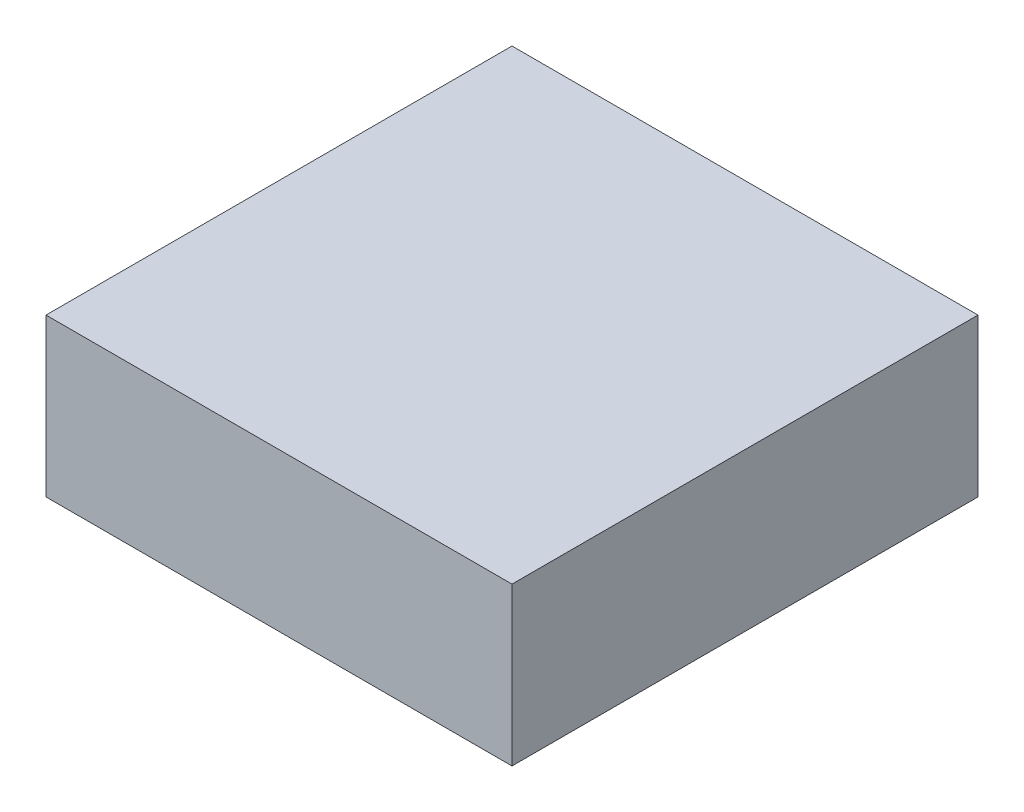
ISO-10303-21;
HEADER;
FILE_DESCRIPTION(('STEP AP214'),'2;1');
FILE_NAME('part.step','',(''),(''),'','','');
FILE_SCHEMA(('AUTOMOTIVE_DESIGN { 1 0 10303 214 1 1 1 1 }'));
ENDSEC;
DATA;
#1=APPLICATION_CONTEXT('core data for automotive mechanical design processes');
#2=APPLICATION_PROTOCOL_DEFINITION('international standard','automotive_design',2000,#1);
#3=PRODUCT_CONTEXT('',#1,'mechanical');
#4=PRODUCT('Part','Part','',(#3));
#5=PRODUCT_RELATED_PRODUCT_CATEGORY('part','',(#4));
#6=PRODUCT_DEFINITION_FORMATION('','',#4);
#7=PRODUCT_DEFINITION_CONTEXT('part definition',#1,'design');
#8=PRODUCT_DEFINITION('design','',#6,#7);
#9=PRODUCT_DEFINITION_SHAPE('','',#8);
#10=(LENGTH_UNIT() NAMED_UNIT(*) SI_UNIT(.MILLI.,.METRE.));
#11=(NAMED_UNIT(*) PLANE_ANGLE_UNIT() SI_UNIT($,.RADIAN.));
#12=(NAMED_UNIT(*) SI_UNIT($,.STERADIAN.) SOLID_ANGLE_UNIT());
#13=UNCERTAINTY_MEASURE_WITH_UNIT(LENGTH_MEASURE(1.E-05),#10,'distance_accuracy_value','');
#14=(GEOMETRIC_REPRESENTATION_CONTEXT(3) GLOBAL_UNCERTAINTY_ASSIGNED_CONTEXT((#13)) GLOBAL_UNIT_ASSIGNED_CONTEXT((#10,
#11,#12)) REPRESENTATION_CONTEXT('',''));
#15=CARTESIAN_POINT('',(0.,0.,0.));
#16=DIRECTION('',(0.,0.,1.));
#17=DIRECTION('',(1.,0.,0.));
#18=AXIS2_PLACEMENT_3D('',#15,#16,#17);
#19=CARTESIAN_POINT('',(-9.017,6.096,-9.017));
#20=DIRECTION('',(0.,0.,-1.));
#21=DIRECTION('',(-1.,0.,0.));
#22=AXIS2_PLACEMENT_3D('',#19,#20,#21);
#23=PLANE('',#22);
#24=DIRECTION('',(1.,0.,0.));
#25=VECTOR('',#24,1.);
#26=CARTESIAN_POINT('',(-9.017,0.,-9.017));
#27=LINE('',#26,#25);
#28=CARTESIAN_POINT('',(-9.017,0.,-9.017));
#29=VERTEX_POINT('',#28);
#30=CARTESIAN_POINT('',(9.017,0.,-9.017));
#31=VERTEX_POINT('',#30);
#32=EDGE_CURVE('E109',#29,#31,#27,.T.);
#33=ORIENTED_EDGE('',*,*,#32,.F.);
#34=DIRECTION('',(0.,-1.,0.));
#35=VECTOR('',#34,1.);
#36=CARTESIAN_POINT('',(-9.017,6.096,-9.017));
#37=LINE('',#36,#35);
#38=CARTESIAN_POINT('',(-9.017,6.096,-9.017));
#39=VERTEX_POINT('',#38);
#40=EDGE_CURVE('E11',#39,#29,#37,.T.);
#41=ORIENTED_EDGE('',*,*,#40,.F.);
#42=DIRECTION('',(1.,0.,0.));
#43=VECTOR('',#42,1.);
#44=CARTESIAN_POINT('',(-9.017,6.096,-9.017));
#45=LINE('',#44,#43);
#46=CARTESIAN_POINT('',(9.017,6.096,-9.017));
#47=VERTEX_POINT('',#46);
#48=EDGE_CURVE('E101',#39,#47,#45,.T.);
#49=ORIENTED_EDGE('',*,*,#48,.T.);
#50=DIRECTION('',(0.,-1.,0.));
#51=VECTOR('',#50,1.);
#52=CARTESIAN_POINT('',(9.017,6.096,-9.017));
#53=LINE('',#52,#51);
#54=EDGE_CURVE('E42',#47,#31,#53,.T.);
#55=ORIENTED_EDGE('',*,*,#54,.T.);
#56=EDGE_LOOP('',(#33,#41,#49,#55));
#57=FACE_BOUND('',#56,.T.);
#58=ADVANCED_FACE('F39',(#57),#23,.T.);
#59=CARTESIAN_POINT('',(-9.017,6.096,9.017));
#60=DIRECTION('',(-1.,0.,0.));
#61=DIRECTION('',(0.,0.,1.));
#62=AXIS2_PLACEMENT_3D('',#59,#60,#61);
#63=PLANE('',#62);
#64=DIRECTION('',(0.,0.,-1.));
#65=VECTOR('',#64,1.);
#66=CARTESIAN_POINT('',(-9.017,0.,9.017));
#67=LINE('',#66,#65);
#68=CARTESIAN_POINT('',(-9.017,0.,9.017));
#69=VERTEX_POINT('',#68);
#70=EDGE_CURVE('E104',#69,#29,#67,.T.);
#71=ORIENTED_EDGE('',*,*,#70,.F.);
#72=DIRECTION('',(0.,-1.,0.));
#73=VECTOR('',#72,1.);
#74=CARTESIAN_POINT('',(-9.017,6.096,9.017));
#75=LINE('',#74,#73);
#76=CARTESIAN_POINT('',(-9.017,6.096,9.017));
#77=VERTEX_POINT('',#76);
#78=EDGE_CURVE('E49',#77,#69,#75,.T.);
#79=ORIENTED_EDGE('',*,*,#78,.F.);
#80=DIRECTION('',(0.,0.,-1.));
#81=VECTOR('',#80,1.);
#82=CARTESIAN_POINT('',(-9.017,6.096,9.017));
#83=LINE('',#82,#81);
#84=EDGE_CURVE('E88',#77,#39,#83,.T.);
#85=ORIENTED_EDGE('',*,*,#84,.T.);
#86=ORIENTED_EDGE('',*,*,#40,.T.);
#87=EDGE_LOOP('',(#71,#79,#85,#86));
#88=FACE_BOUND('',#87,.T.);
#89=ADVANCED_FACE('F125',(#88),#63,.T.);
#90=CARTESIAN_POINT('',(-9.017,6.096,9.017));
#91=DIRECTION('',(0.,0.,-1.));
#92=DIRECTION('',(-1.,0.,0.));
#93=AXIS2_PLACEMENT_3D('',#90,#91,#92);
#94=PLANE('',#93);
#95=DIRECTION('',(1.,0.,0.));
#96=VECTOR('',#95,1.);
#97=CARTESIAN_POINT('',(-9.017,0.,9.017));
#98=LINE('',#97,#96);
#99=CARTESIAN_POINT('',(9.017,0.,9.017));
#100=VERTEX_POINT('',#99);
#101=EDGE_CURVE('E94',#69,#100,#98,.T.);
#102=ORIENTED_EDGE('',*,*,#101,.T.);
#103=DIRECTION('',(0.,-1.,0.));
#104=VECTOR('',#103,1.);
#105=CARTESIAN_POINT('',(9.017,6.096,9.017));
#106=LINE('',#105,#104);
#107=CARTESIAN_POINT('',(9.017,6.096,9.017));
#108=VERTEX_POINT('',#107);
#109=EDGE_CURVE('E92',#108,#100,#106,.T.);
#110=ORIENTED_EDGE('',*,*,#109,.F.);
#111=DIRECTION('',(1.,0.,0.));
#112=VECTOR('',#111,1.);
#113=CARTESIAN_POINT('',(-9.017,6.096,9.017));
#114=LINE('',#113,#112);
#115=EDGE_CURVE('E85',#77,#108,#114,.T.);
#116=ORIENTED_EDGE('',*,*,#115,.F.);
#117=ORIENTED_EDGE('',*,*,#78,.T.);
#118=EDGE_LOOP('',(#102,#110,#116,#117));
#119=FACE_BOUND('',#118,.T.);
#120=ADVANCED_FACE('F93',(#119),#94,.F.);
#121=CARTESIAN_POINT('',(9.017,6.096,9.017));
#122=DIRECTION('',(-1.,0.,0.));
#123=DIRECTION('',(0.,0.,1.));
#124=AXIS2_PLACEMENT_3D('',#121,#122,#123);
#125=PLANE('',#124);
#126=DIRECTION('',(0.,0.,-1.));
#127=VECTOR('',#126,1.);
#128=CARTESIAN_POINT('',(9.017,0.,9.017));
#129=LINE('',#128,#127);
#130=EDGE_CURVE('E113',#100,#31,#129,.T.);
#131=ORIENTED_EDGE('',*,*,#130,.T.);
#132=ORIENTED_EDGE('',*,*,#54,.F.);
#133=DIRECTION('',(0.,0.,-1.));
#134=VECTOR('',#133,1.);
#135=CARTESIAN_POINT('',(9.017,6.096,9.017));
#136=LINE('',#135,#134);
#137=EDGE_CURVE('E82',#108,#47,#136,.T.);
#138=ORIENTED_EDGE('',*,*,#137,.F.);
#139=ORIENTED_EDGE('',*,*,#109,.T.);
#140=EDGE_LOOP('',(#131,#132,#138,#139));
#141=FACE_BOUND('',#140,.T.);
#142=ADVANCED_FACE('F99',(#141),#125,.F.);
#143=CARTESIAN_POINT('',(0.,6.096,0.));
#144=DIRECTION('',(0.,1.,0.));
#145=DIRECTION('',(0.,0.,1.));
#146=AXIS2_PLACEMENT_3D('',#143,#144,#145);
#147=PLANE('',#146);
#148=ORIENTED_EDGE('',*,*,#48,.F.);
#149=ORIENTED_EDGE('',*,*,#84,.F.);
#150=ORIENTED_EDGE('',*,*,#115,.T.);
#151=ORIENTED_EDGE('',*,*,#137,.T.);
#152=EDGE_LOOP('',(#148,#149,#150,#151));
#153=FACE_BOUND('',#152,.T.);
#154=ADVANCED_FACE('F87',(#153),#147,.T.);
#155=CARTESIAN_POINT('',(0.,0.,0.));
#156=DIRECTION('',(0.,1.,0.));
#157=DIRECTION('',(0.,0.,1.));
#158=AXIS2_PLACEMENT_3D('',#155,#156,#157);
#159=PLANE('',#158);
#160=ORIENTED_EDGE('',*,*,#32,.T.);
#161=ORIENTED_EDGE('',*,*,#130,.F.);
#162=ORIENTED_EDGE('',*,*,#101,.F.);
#163=ORIENTED_EDGE('',*,*,#70,.T.);
#164=EDGE_LOOP('',(#160,#161,#162,#163));
#165=FACE_BOUND('',#164,.T.);
#166=ADVANCED_FACE('F124',(#165),#159,.F.);
#167=CLOSED_SHELL('',(#58,#89,#120,#142,#154,#166));
#168=MANIFOLD_SOLID_BREP('B2',#167);
#169=ADVANCED_BREP_SHAPE_REPRESENTATION('',(#18,#168),#14);
#170=SHAPE_DEFINITION_REPRESENTATION(#9,#169);
ENDSEC;
END-ISO-10303-21;
